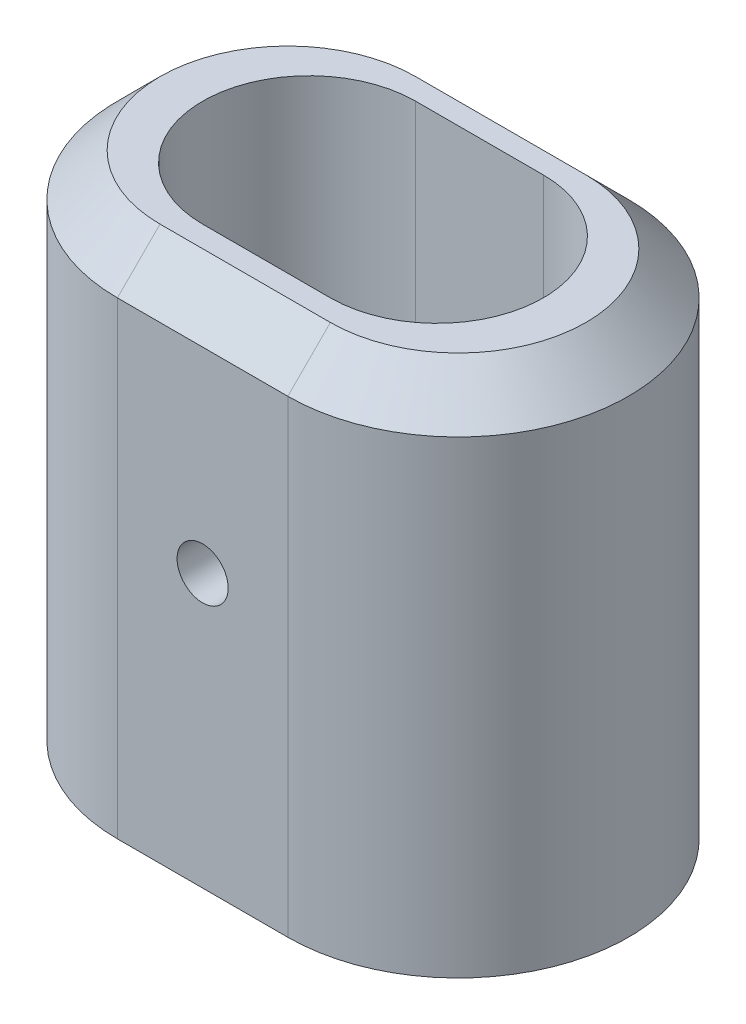
ISO-10303-21;
HEADER;
FILE_DESCRIPTION(('STEP AP214'),'2;1');
FILE_NAME('part.step','',(''),(''),'','','');
FILE_SCHEMA(('AUTOMOTIVE_DESIGN { 1 0 10303 214 1 1 1 1 }'));
ENDSEC;
DATA;
#1=APPLICATION_CONTEXT('core data for automotive mechanical design processes');
#2=APPLICATION_PROTOCOL_DEFINITION('international standard','automotive_design',2000,#1);
#3=PRODUCT_CONTEXT('',#1,'mechanical');
#4=PRODUCT('Part','Part','',(#3));
#5=PRODUCT_RELATED_PRODUCT_CATEGORY('part','',(#4));
#6=PRODUCT_DEFINITION_FORMATION('','',#4);
#7=PRODUCT_DEFINITION_CONTEXT('part definition',#1,'design');
#8=PRODUCT_DEFINITION('design','',#6,#7);
#9=PRODUCT_DEFINITION_SHAPE('','',#8);
#10=(LENGTH_UNIT() NAMED_UNIT(*) SI_UNIT(.MILLI.,.METRE.));
#11=(NAMED_UNIT(*) PLANE_ANGLE_UNIT() SI_UNIT($,.RADIAN.));
#12=(NAMED_UNIT(*) SI_UNIT($,.STERADIAN.) SOLID_ANGLE_UNIT());
#13=UNCERTAINTY_MEASURE_WITH_UNIT(LENGTH_MEASURE(1.E-05),#10,'distance_accuracy_value','');
#14=(GEOMETRIC_REPRESENTATION_CONTEXT(3) GLOBAL_UNCERTAINTY_ASSIGNED_CONTEXT((#13)) GLOBAL_UNIT_ASSIGNED_CONTEXT((#10,
#11,#12)) REPRESENTATION_CONTEXT('',''));
#15=CARTESIAN_POINT('',(0.,0.,0.));
#16=DIRECTION('',(0.,0.,1.));
#17=DIRECTION('',(1.,0.,0.));
#18=AXIS2_PLACEMENT_3D('',#15,#16,#17);
#19=CARTESIAN_POINT('',(0.,60.,-20.));
#20=DIRECTION('',(0.,0.,-1.));
#21=DIRECTION('',(-1.,0.,0.));
#22=AXIS2_PLACEMENT_3D('',#19,#20,#21);
#23=PLANE('',#22);
#24=CARTESIAN_POINT('',(0.,32.,-20.));
#25=DIRECTION('',(0.,0.,-1.));
#26=DIRECTION('',(-1.,0.,0.));
#27=AXIS2_PLACEMENT_3D('',#24,#25,#26);
#28=CIRCLE('',#27,3.);
#29=CARTESIAN_POINT('',(-3.,32.,-20.));
#30=VERTEX_POINT('',#29);
#31=EDGE_CURVE('E143',#30,#30,#28,.T.);
#32=ORIENTED_EDGE('',*,*,#31,.F.);
#33=EDGE_LOOP('',(#32));
#34=FACE_BOUND('',#33,.T.);
#35=DIRECTION('',(0.,-1.,0.));
#36=VECTOR('',#35,1.);
#37=CARTESIAN_POINT('',(-10.,60.,-20.));
#38=LINE('',#37,#36);
#39=CARTESIAN_POINT('',(-10.,55.,-20.));
#40=VERTEX_POINT('',#39);
#41=CARTESIAN_POINT('',(-10.,0.,-20.));
#42=VERTEX_POINT('',#41);
#43=EDGE_CURVE('E172',#40,#42,#38,.T.);
#44=ORIENTED_EDGE('',*,*,#43,.F.);
#45=DIRECTION('',(1.,0.,0.));
#46=VECTOR('',#45,1.);
#47=CARTESIAN_POINT('',(0.,55.,-20.));
#48=LINE('',#47,#46);
#49=CARTESIAN_POINT('',(10.,55.,-20.));
#50=VERTEX_POINT('',#49);
#51=EDGE_CURVE('E190',#40,#50,#48,.T.);
#52=ORIENTED_EDGE('',*,*,#51,.T.);
#53=DIRECTION('',(0.,-1.,0.));
#54=VECTOR('',#53,1.);
#55=CARTESIAN_POINT('',(10.,60.,-20.));
#56=LINE('',#55,#54);
#57=CARTESIAN_POINT('',(10.,0.,-20.));
#58=VERTEX_POINT('',#57);
#59=EDGE_CURVE('E122',#50,#58,#56,.T.);
#60=ORIENTED_EDGE('',*,*,#59,.T.);
#61=DIRECTION('',(1.,0.,0.));
#62=VECTOR('',#61,1.);
#63=CARTESIAN_POINT('',(0.,0.,-20.));
#64=LINE('',#63,#62);
#65=EDGE_CURVE('E159',#42,#58,#64,.T.);
#66=ORIENTED_EDGE('',*,*,#65,.F.);
#67=EDGE_LOOP('',(#44,#52,#60,#66));
#68=FACE_BOUND('',#67,.T.);
#69=ADVANCED_FACE('F35',(#34,#68),#23,.T.);
#70=CARTESIAN_POINT('',(-10.,60.,0.));
#71=DIRECTION('',(0.,-1.,0.));
#72=DIRECTION('',(0.,0.,-1.));
#73=AXIS2_PLACEMENT_3D('',#70,#71,#72);
#74=CYLINDRICAL_SURFACE('',#73,20.);
#75=DIRECTION('',(0.,-1.,0.));
#76=VECTOR('',#75,1.);
#77=CARTESIAN_POINT('',(-10.,60.,20.));
#78=LINE('',#77,#76);
#79=CARTESIAN_POINT('',(-10.,55.,20.));
#80=VERTEX_POINT('',#79);
#81=CARTESIAN_POINT('',(-10.,0.,20.));
#82=VERTEX_POINT('',#81);
#83=EDGE_CURVE('E170',#80,#82,#78,.T.);
#84=ORIENTED_EDGE('',*,*,#83,.F.);
#85=CARTESIAN_POINT('',(-10.,55.,0.));
#86=DIRECTION('',(0.,1.,0.));
#87=DIRECTION('',(0.,0.,1.));
#88=AXIS2_PLACEMENT_3D('',#85,#86,#87);
#89=CIRCLE('',#88,20.);
#90=EDGE_CURVE('E44',#80,#40,#89,.F.);
#91=ORIENTED_EDGE('',*,*,#90,.T.);
#92=ORIENTED_EDGE('',*,*,#43,.T.);
#93=CARTESIAN_POINT('',(-10.,0.,0.));
#94=DIRECTION('',(0.,1.,0.));
#95=DIRECTION('',(0.,0.,1.));
#96=AXIS2_PLACEMENT_3D('',#93,#94,#95);
#97=CIRCLE('',#96,20.);
#98=EDGE_CURVE('E162',#42,#82,#97,.T.);
#99=ORIENTED_EDGE('',*,*,#98,.T.);
#100=EDGE_LOOP('',(#84,#91,#92,#99));
#101=FACE_BOUND('',#100,.T.);
#102=ADVANCED_FACE('F237',(#101),#74,.T.);
#103=CARTESIAN_POINT('',(0.,60.,20.));
#104=DIRECTION('',(0.,0.,1.));
#105=DIRECTION('',(1.,0.,0.));
#106=AXIS2_PLACEMENT_3D('',#103,#104,#105);
#107=PLANE('',#106);
#108=CARTESIAN_POINT('',(0.,32.,20.));
#109=DIRECTION('',(0.,0.,1.));
#110=DIRECTION('',(1.,0.,0.));
#111=AXIS2_PLACEMENT_3D('',#108,#109,#110);
#112=CIRCLE('',#111,3.);
#113=CARTESIAN_POINT('',(3.,32.,20.));
#114=VERTEX_POINT('',#113);
#115=EDGE_CURVE('E363',#114,#114,#112,.T.);
#116=ORIENTED_EDGE('',*,*,#115,.F.);
#117=EDGE_LOOP('',(#116));
#118=FACE_BOUND('',#117,.T.);
#119=DIRECTION('',(0.,-1.,0.));
#120=VECTOR('',#119,1.);
#121=CARTESIAN_POINT('',(10.,60.,20.));
#122=LINE('',#121,#120);
#123=CARTESIAN_POINT('',(10.,55.,20.));
#124=VERTEX_POINT('',#123);
#125=CARTESIAN_POINT('',(10.,0.,20.));
#126=VERTEX_POINT('',#125);
#127=EDGE_CURVE('E168',#124,#126,#122,.T.);
#128=ORIENTED_EDGE('',*,*,#127,.F.);
#129=DIRECTION('',(-1.,0.,0.));
#130=VECTOR('',#129,1.);
#131=CARTESIAN_POINT('',(0.,55.,20.));
#132=LINE('',#131,#130);
#133=EDGE_CURVE('E11',#124,#80,#132,.T.);
#134=ORIENTED_EDGE('',*,*,#133,.T.);
#135=ORIENTED_EDGE('',*,*,#83,.T.);
#136=DIRECTION('',(-1.,0.,0.));
#137=VECTOR('',#136,1.);
#138=CARTESIAN_POINT('',(0.,0.,20.));
#139=LINE('',#138,#137);
#140=EDGE_CURVE('E140',#126,#82,#139,.T.);
#141=ORIENTED_EDGE('',*,*,#140,.F.);
#142=EDGE_LOOP('',(#128,#134,#135,#141));
#143=FACE_BOUND('',#142,.T.);
#144=ADVANCED_FACE('F243',(#118,#143),#107,.T.);
#145=CARTESIAN_POINT('',(-7.5,60.,0.));
#146=DIRECTION('',(0.,-1.,0.));
#147=DIRECTION('',(0.,0.,-1.));
#148=AXIS2_PLACEMENT_3D('',#145,#146,#147);
#149=CYLINDRICAL_SURFACE('',#148,12.5);
#150=CARTESIAN_POINT('',(-7.5,0.,0.));
#151=DIRECTION('',(0.,1.,0.));
#152=DIRECTION('',(0.,0.,1.));
#153=AXIS2_PLACEMENT_3D('',#150,#151,#152);
#154=CIRCLE('',#153,12.5);
#155=CARTESIAN_POINT('',(-7.5,0.,-12.5));
#156=VERTEX_POINT('',#155);
#157=CARTESIAN_POINT('',(-7.5,0.,12.5));
#158=VERTEX_POINT('',#157);
#159=EDGE_CURVE('E118',#156,#158,#154,.T.);
#160=ORIENTED_EDGE('',*,*,#159,.F.);
#161=DIRECTION('',(0.,-1.,0.));
#162=VECTOR('',#161,1.);
#163=CARTESIAN_POINT('',(-7.5,60.,-12.5));
#164=LINE('',#163,#162);
#165=CARTESIAN_POINT('',(-7.5,60.,-12.5));
#166=VERTEX_POINT('',#165);
#167=EDGE_CURVE('E112',#166,#156,#164,.T.);
#168=ORIENTED_EDGE('',*,*,#167,.F.);
#169=CARTESIAN_POINT('',(-7.5,60.,0.));
#170=DIRECTION('',(0.,1.,0.));
#171=DIRECTION('',(0.,0.,1.));
#172=AXIS2_PLACEMENT_3D('',#169,#170,#171);
#173=CIRCLE('',#172,12.5);
#174=CARTESIAN_POINT('',(-7.5,60.,12.5));
#175=VERTEX_POINT('',#174);
#176=EDGE_CURVE('E116',#166,#175,#173,.T.);
#177=ORIENTED_EDGE('',*,*,#176,.T.);
#178=DIRECTION('',(0.,-1.,0.));
#179=VECTOR('',#178,1.);
#180=CARTESIAN_POINT('',(-7.5,60.,12.5));
#181=LINE('',#180,#179);
#182=EDGE_CURVE('E148',#175,#158,#181,.T.);
#183=ORIENTED_EDGE('',*,*,#182,.T.);
#184=EDGE_LOOP('',(#160,#168,#177,#183));
#185=FACE_BOUND('',#184,.T.);
#186=ADVANCED_FACE('F114',(#185),#149,.F.);
#187=CARTESIAN_POINT('',(0.,60.,-12.5));
#188=DIRECTION('',(0.,0.,-1.));
#189=DIRECTION('',(-1.,0.,0.));
#190=AXIS2_PLACEMENT_3D('',#187,#188,#189);
#191=PLANE('',#190);
#192=CARTESIAN_POINT('',(0.,32.,-12.5));
#193=DIRECTION('',(0.,0.,-1.));
#194=DIRECTION('',(-1.,0.,0.));
#195=AXIS2_PLACEMENT_3D('',#192,#193,#194);
#196=CIRCLE('',#195,3.);
#197=CARTESIAN_POINT('',(-3.,32.,-12.5));
#198=VERTEX_POINT('',#197);
#199=EDGE_CURVE('E361',#198,#198,#196,.T.);
#200=ORIENTED_EDGE('',*,*,#199,.T.);
#201=EDGE_LOOP('',(#200));
#202=FACE_BOUND('',#201,.T.);
#203=DIRECTION('',(1.,0.,0.));
#204=VECTOR('',#203,1.);
#205=CARTESIAN_POINT('',(0.,0.,-12.5));
#206=LINE('',#205,#204);
#207=CARTESIAN_POINT('',(7.5,0.,-12.5));
#208=VERTEX_POINT('',#207);
#209=EDGE_CURVE('E150',#156,#208,#206,.T.);
#210=ORIENTED_EDGE('',*,*,#209,.T.);
#211=DIRECTION('',(0.,-1.,0.));
#212=VECTOR('',#211,1.);
#213=CARTESIAN_POINT('',(7.5,60.,-12.5));
#214=LINE('',#213,#212);
#215=CARTESIAN_POINT('',(7.5,60.,-12.5));
#216=VERTEX_POINT('',#215);
#217=EDGE_CURVE('E123',#216,#208,#214,.T.);
#218=ORIENTED_EDGE('',*,*,#217,.F.);
#219=DIRECTION('',(1.,0.,0.));
#220=VECTOR('',#219,1.);
#221=CARTESIAN_POINT('',(0.,60.,-12.5));
#222=LINE('',#221,#220);
#223=EDGE_CURVE('E126',#166,#216,#222,.T.);
#224=ORIENTED_EDGE('',*,*,#223,.F.);
#225=ORIENTED_EDGE('',*,*,#167,.T.);
#226=EDGE_LOOP('',(#210,#218,#224,#225));
#227=FACE_BOUND('',#226,.T.);
#228=ADVANCED_FACE('F127',(#202,#227),#191,.F.);
#229=CARTESIAN_POINT('',(7.5,60.,0.));
#230=DIRECTION('',(0.,-1.,0.));
#231=DIRECTION('',(0.,0.,-1.));
#232=AXIS2_PLACEMENT_3D('',#229,#230,#231);
#233=CYLINDRICAL_SURFACE('',#232,12.5);
#234=CARTESIAN_POINT('',(7.5,0.,0.));
#235=DIRECTION('',(0.,1.,0.));
#236=DIRECTION('',(0.,0.,1.));
#237=AXIS2_PLACEMENT_3D('',#234,#235,#236);
#238=CIRCLE('',#237,12.5);
#239=CARTESIAN_POINT('',(7.5,0.,12.5));
#240=VERTEX_POINT('',#239);
#241=EDGE_CURVE('E153',#240,#208,#238,.T.);
#242=ORIENTED_EDGE('',*,*,#241,.F.);
#243=DIRECTION('',(0.,-1.,0.));
#244=VECTOR('',#243,1.);
#245=CARTESIAN_POINT('',(7.5,60.,12.5));
#246=LINE('',#245,#244);
#247=CARTESIAN_POINT('',(7.5,60.,12.5));
#248=VERTEX_POINT('',#247);
#249=EDGE_CURVE('E176',#248,#240,#246,.T.);
#250=ORIENTED_EDGE('',*,*,#249,.F.);
#251=CARTESIAN_POINT('',(7.5,60.,0.));
#252=DIRECTION('',(0.,1.,0.));
#253=DIRECTION('',(0.,0.,1.));
#254=AXIS2_PLACEMENT_3D('',#251,#252,#253);
#255=CIRCLE('',#254,12.5);
#256=EDGE_CURVE('E131',#248,#216,#255,.T.);
#257=ORIENTED_EDGE('',*,*,#256,.T.);
#258=ORIENTED_EDGE('',*,*,#217,.T.);
#259=EDGE_LOOP('',(#242,#250,#257,#258));
#260=FACE_BOUND('',#259,.T.);
#261=ADVANCED_FACE('F250',(#260),#233,.F.);
#262=CARTESIAN_POINT('',(0.,60.,12.5));
#263=DIRECTION('',(0.,0.,1.));
#264=DIRECTION('',(1.,0.,0.));
#265=AXIS2_PLACEMENT_3D('',#262,#263,#264);
#266=PLANE('',#265);
#267=CARTESIAN_POINT('',(0.,32.,12.5));
#268=DIRECTION('',(0.,0.,1.));
#269=DIRECTION('',(1.,0.,0.));
#270=AXIS2_PLACEMENT_3D('',#267,#268,#269);
#271=CIRCLE('',#270,3.);
#272=CARTESIAN_POINT('',(3.,32.,12.5));
#273=VERTEX_POINT('',#272);
#274=EDGE_CURVE('E39',#273,#273,#271,.T.);
#275=ORIENTED_EDGE('',*,*,#274,.T.);
#276=EDGE_LOOP('',(#275));
#277=FACE_BOUND('',#276,.T.);
#278=DIRECTION('',(-1.,0.,0.));
#279=VECTOR('',#278,1.);
#280=CARTESIAN_POINT('',(0.,0.,12.5));
#281=LINE('',#280,#279);
#282=EDGE_CURVE('E156',#240,#158,#281,.T.);
#283=ORIENTED_EDGE('',*,*,#282,.T.);
#284=ORIENTED_EDGE('',*,*,#182,.F.);
#285=DIRECTION('',(-1.,0.,0.));
#286=VECTOR('',#285,1.);
#287=CARTESIAN_POINT('',(0.,60.,12.5));
#288=LINE('',#287,#286);
#289=EDGE_CURVE('E135',#248,#175,#288,.T.);
#290=ORIENTED_EDGE('',*,*,#289,.F.);
#291=ORIENTED_EDGE('',*,*,#249,.T.);
#292=EDGE_LOOP('',(#283,#284,#290,#291));
#293=FACE_BOUND('',#292,.T.);
#294=ADVANCED_FACE('F233',(#277,#293),#266,.F.);
#295=CARTESIAN_POINT('',(10.,60.,0.));
#296=DIRECTION('',(0.,-1.,0.));
#297=DIRECTION('',(0.,0.,-1.));
#298=AXIS2_PLACEMENT_3D('',#295,#296,#297);
#299=CYLINDRICAL_SURFACE('',#298,20.);
#300=ORIENTED_EDGE('',*,*,#59,.F.);
#301=CARTESIAN_POINT('',(10.,55.,0.));
#302=DIRECTION('',(0.,1.,0.));
#303=DIRECTION('',(0.,0.,1.));
#304=AXIS2_PLACEMENT_3D('',#301,#302,#303);
#305=CIRCLE('',#304,20.);
#306=EDGE_CURVE('E187',#50,#124,#305,.F.);
#307=ORIENTED_EDGE('',*,*,#306,.T.);
#308=ORIENTED_EDGE('',*,*,#127,.T.);
#309=CARTESIAN_POINT('',(10.,0.,0.));
#310=DIRECTION('',(0.,1.,0.));
#311=DIRECTION('',(0.,0.,1.));
#312=AXIS2_PLACEMENT_3D('',#309,#310,#311);
#313=CIRCLE('',#312,20.);
#314=EDGE_CURVE('E137',#126,#58,#313,.T.);
#315=ORIENTED_EDGE('',*,*,#314,.T.);
#316=EDGE_LOOP('',(#300,#307,#308,#315));
#317=FACE_BOUND('',#316,.T.);
#318=ADVANCED_FACE('F218',(#317),#299,.T.);
#319=CARTESIAN_POINT('',(0.,60.,0.));
#320=DIRECTION('',(0.,1.,0.));
#321=DIRECTION('',(0.,0.,1.));
#322=AXIS2_PLACEMENT_3D('',#319,#320,#321);
#323=PLANE('',#322);
#324=DIRECTION('',(1.,0.,0.));
#325=VECTOR('',#324,1.);
#326=CARTESIAN_POINT('',(0.,60.,15.));
#327=LINE('',#326,#325);
#328=CARTESIAN_POINT('',(-10.,60.,15.));
#329=VERTEX_POINT('',#328);
#330=CARTESIAN_POINT('',(10.,60.,15.));
#331=VERTEX_POINT('',#330);
#332=EDGE_CURVE('E174',#329,#331,#327,.T.);
#333=ORIENTED_EDGE('',*,*,#332,.T.);
#334=CARTESIAN_POINT('',(10.,60.,0.));
#335=DIRECTION('',(0.,1.,0.));
#336=DIRECTION('',(0.,0.,1.));
#337=AXIS2_PLACEMENT_3D('',#334,#335,#336);
#338=CIRCLE('',#337,15.);
#339=CARTESIAN_POINT('',(10.,60.,-15.));
#340=VERTEX_POINT('',#339);
#341=EDGE_CURVE('E184',#331,#340,#338,.T.);
#342=ORIENTED_EDGE('',*,*,#341,.T.);
#343=DIRECTION('',(-1.,0.,0.));
#344=VECTOR('',#343,1.);
#345=CARTESIAN_POINT('',(0.,60.,-15.));
#346=LINE('',#345,#344);
#347=CARTESIAN_POINT('',(-10.,60.,-15.));
#348=VERTEX_POINT('',#347);
#349=EDGE_CURVE('E182',#340,#348,#346,.T.);
#350=ORIENTED_EDGE('',*,*,#349,.T.);
#351=CARTESIAN_POINT('',(-10.,60.,0.));
#352=DIRECTION('',(0.,1.,0.));
#353=DIRECTION('',(0.,0.,1.));
#354=AXIS2_PLACEMENT_3D('',#351,#352,#353);
#355=CIRCLE('',#354,15.);
#356=EDGE_CURVE('E180',#348,#329,#355,.T.);
#357=ORIENTED_EDGE('',*,*,#356,.T.);
#358=EDGE_LOOP('',(#333,#342,#350,#357));
#359=FACE_BOUND('',#358,.T.);
#360=ORIENTED_EDGE('',*,*,#176,.F.);
#361=ORIENTED_EDGE('',*,*,#223,.T.);
#362=ORIENTED_EDGE('',*,*,#256,.F.);
#363=ORIENTED_EDGE('',*,*,#289,.T.);
#364=EDGE_LOOP('',(#360,#361,#362,#363));
#365=FACE_BOUND('',#364,.T.);
#366=ADVANCED_FACE('F133',(#359,#365),#323,.T.);
#367=CARTESIAN_POINT('',(0.,0.,0.));
#368=DIRECTION('',(0.,1.,0.));
#369=DIRECTION('',(0.,0.,1.));
#370=AXIS2_PLACEMENT_3D('',#367,#368,#369);
#371=PLANE('',#370);
#372=ORIENTED_EDGE('',*,*,#159,.T.);
#373=ORIENTED_EDGE('',*,*,#282,.F.);
#374=ORIENTED_EDGE('',*,*,#241,.T.);
#375=ORIENTED_EDGE('',*,*,#209,.F.);
#376=EDGE_LOOP('',(#372,#373,#374,#375));
#377=FACE_BOUND('',#376,.T.);
#378=ORIENTED_EDGE('',*,*,#65,.T.);
#379=ORIENTED_EDGE('',*,*,#314,.F.);
#380=ORIENTED_EDGE('',*,*,#140,.T.);
#381=ORIENTED_EDGE('',*,*,#98,.F.);
#382=EDGE_LOOP('',(#378,#379,#380,#381));
#383=FACE_BOUND('',#382,.T.);
#384=ADVANCED_FACE('F225',(#377,#383),#371,.F.);
#385=CARTESIAN_POINT('',(-10.,60.,0.));
#386=DIRECTION('',(0.,-1.,0.));
#387=DIRECTION('',(0.,0.,-1.));
#388=AXIS2_PLACEMENT_3D('',#385,#386,#387);
#389=CONICAL_SURFACE('',#388,15.,0.78539816339745);
#390=DIRECTION('',(0.,0.707106781186546,0.707106781186548));
#391=VECTOR('',#390,1.);
#392=CARTESIAN_POINT('',(-10.,55.,-20.));
#393=LINE('',#392,#391);
#394=EDGE_CURVE('E197',#40,#348,#393,.T.);
#395=ORIENTED_EDGE('',*,*,#394,.F.);
#396=ORIENTED_EDGE('',*,*,#90,.F.);
#397=DIRECTION('',(0.,-0.707106781186546,0.707106781186548));
#398=VECTOR('',#397,1.);
#399=CARTESIAN_POINT('',(-10.,60.,15.));
#400=LINE('',#399,#398);
#401=EDGE_CURVE('E151',#329,#80,#400,.T.);
#402=ORIENTED_EDGE('',*,*,#401,.F.);
#403=ORIENTED_EDGE('',*,*,#356,.F.);
#404=EDGE_LOOP('',(#395,#396,#402,#403));
#405=FACE_BOUND('',#404,.T.);
#406=ADVANCED_FACE('F37',(#405),#389,.T.);
#407=CARTESIAN_POINT('',(0.,55.,20.));
#408=DIRECTION('',(0.,-0.707106781186548,-0.707106781186546));
#409=DIRECTION('',(-1.,0.,0.));
#410=AXIS2_PLACEMENT_3D('',#407,#408,#409);
#411=PLANE('',#410);
#412=ORIENTED_EDGE('',*,*,#401,.T.);
#413=ORIENTED_EDGE('',*,*,#133,.F.);
#414=DIRECTION('',(0.,-0.707106781186546,0.707106781186548));
#415=VECTOR('',#414,1.);
#416=CARTESIAN_POINT('',(10.,60.,15.));
#417=LINE('',#416,#415);
#418=EDGE_CURVE('E195',#331,#124,#417,.T.);
#419=ORIENTED_EDGE('',*,*,#418,.F.);
#420=ORIENTED_EDGE('',*,*,#332,.F.);
#421=EDGE_LOOP('',(#412,#413,#419,#420));
#422=FACE_BOUND('',#421,.T.);
#423=ADVANCED_FACE('F203',(#422),#411,.F.);
#424=CARTESIAN_POINT('',(0.,55.,-20.));
#425=DIRECTION('',(0.,-0.707106781186548,0.707106781186546));
#426=DIRECTION('',(1.,0.,0.));
#427=AXIS2_PLACEMENT_3D('',#424,#425,#426);
#428=PLANE('',#427);
#429=ORIENTED_EDGE('',*,*,#394,.T.);
#430=ORIENTED_EDGE('',*,*,#349,.F.);
#431=DIRECTION('',(0.,0.707106781186546,0.707106781186548));
#432=VECTOR('',#431,1.);
#433=CARTESIAN_POINT('',(10.,55.,-20.));
#434=LINE('',#433,#432);
#435=EDGE_CURVE('E193',#50,#340,#434,.T.);
#436=ORIENTED_EDGE('',*,*,#435,.F.);
#437=ORIENTED_EDGE('',*,*,#51,.F.);
#438=EDGE_LOOP('',(#429,#430,#436,#437));
#439=FACE_BOUND('',#438,.T.);
#440=ADVANCED_FACE('F212',(#439),#428,.F.);
#441=CARTESIAN_POINT('',(10.,60.,0.));
#442=DIRECTION('',(0.,-1.,0.));
#443=DIRECTION('',(0.,0.,-1.));
#444=AXIS2_PLACEMENT_3D('',#441,#442,#443);
#445=CONICAL_SURFACE('',#444,15.,0.78539816339745);
#446=ORIENTED_EDGE('',*,*,#418,.T.);
#447=ORIENTED_EDGE('',*,*,#306,.F.);
#448=ORIENTED_EDGE('',*,*,#435,.T.);
#449=ORIENTED_EDGE('',*,*,#341,.F.);
#450=EDGE_LOOP('',(#446,#447,#448,#449));
#451=FACE_BOUND('',#450,.T.);
#452=ADVANCED_FACE('F221',(#451),#445,.T.);
#453=CARTESIAN_POINT('',(0.,32.,-40.));
#454=DIRECTION('',(0.,0.,1.));
#455=DIRECTION('',(1.,0.,0.));
#456=AXIS2_PLACEMENT_3D('',#453,#454,#455);
#457=CYLINDRICAL_SURFACE('',#456,3.);
#458=ORIENTED_EDGE('',*,*,#115,.T.);
#459=EDGE_LOOP('',(#458));
#460=FACE_BOUND('',#459,.T.);
#461=ORIENTED_EDGE('',*,*,#274,.F.);
#462=EDGE_LOOP('',(#461));
#463=FACE_BOUND('',#462,.T.);
#464=ADVANCED_FACE('F262',(#460,#463),#457,.F.);
#465=ORIENTED_EDGE('',*,*,#31,.T.);
#466=EDGE_LOOP('',(#465));
#467=FACE_BOUND('',#466,.T.);
#468=ORIENTED_EDGE('',*,*,#199,.F.);
#469=EDGE_LOOP('',(#468));
#470=FACE_BOUND('',#469,.T.);
#471=ADVANCED_FACE('F345',(#467,#470),#457,.F.);
#472=CLOSED_SHELL('',(#69,#102,#144,#186,#228,#261,#294,#318,#366,#384,#406,#423,#440,#452,#464,#471));
#473=MANIFOLD_SOLID_BREP('B2',#472);
#474=ADVANCED_BREP_SHAPE_REPRESENTATION('',(#18,#473),#14);
#475=SHAPE_DEFINITION_REPRESENTATION(#9,#474);
ENDSEC;
END-ISO-10303-21;
